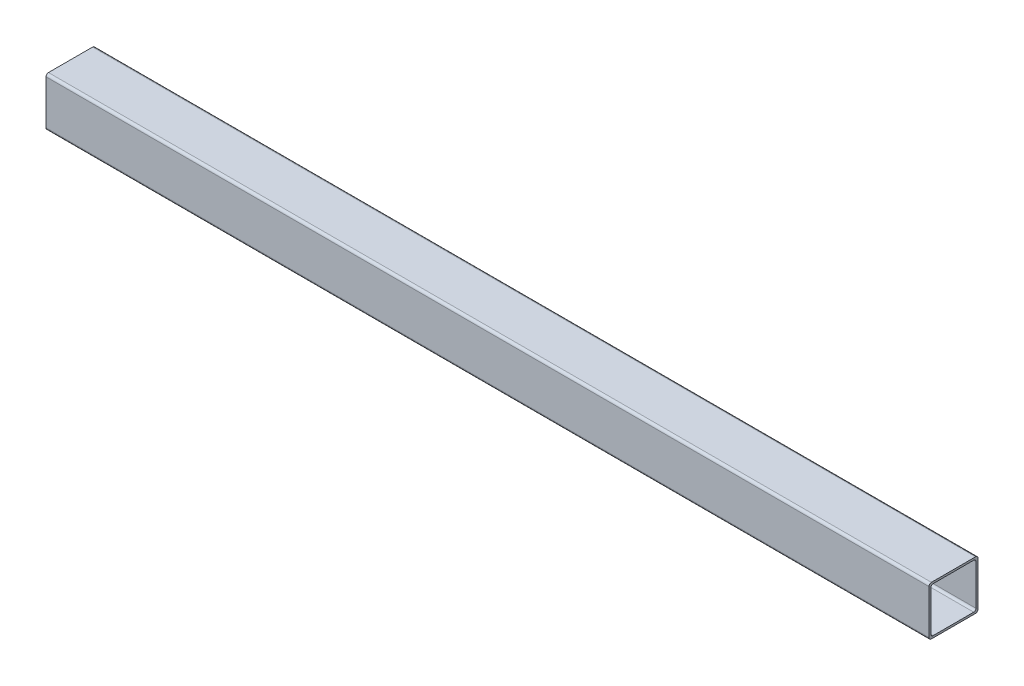
ISO-10303-21;
HEADER;
FILE_DESCRIPTION(('STEP AP214'),'2;1');
FILE_NAME('part.step','',(''),(''),'','','');
FILE_SCHEMA(('AUTOMOTIVE_DESIGN { 1 0 10303 214 1 1 1 1 }'));
ENDSEC;
DATA;
#1=APPLICATION_CONTEXT('core data for automotive mechanical design processes');
#2=APPLICATION_PROTOCOL_DEFINITION('international standard','automotive_design',2000,#1);
#3=PRODUCT_CONTEXT('',#1,'mechanical');
#4=PRODUCT('Part','Part','',(#3));
#5=PRODUCT_RELATED_PRODUCT_CATEGORY('part','',(#4));
#6=PRODUCT_DEFINITION_FORMATION('','',#4);
#7=PRODUCT_DEFINITION_CONTEXT('part definition',#1,'design');
#8=PRODUCT_DEFINITION('design','',#6,#7);
#9=PRODUCT_DEFINITION_SHAPE('','',#8);
#10=(LENGTH_UNIT() NAMED_UNIT(*) SI_UNIT(.MILLI.,.METRE.));
#11=(NAMED_UNIT(*) PLANE_ANGLE_UNIT() SI_UNIT($,.RADIAN.));
#12=(NAMED_UNIT(*) SI_UNIT($,.STERADIAN.) SOLID_ANGLE_UNIT());
#13=UNCERTAINTY_MEASURE_WITH_UNIT(LENGTH_MEASURE(1.E-05),#10,'distance_accuracy_value','');
#14=(GEOMETRIC_REPRESENTATION_CONTEXT(3) GLOBAL_UNCERTAINTY_ASSIGNED_CONTEXT((#13)) GLOBAL_UNIT_ASSIGNED_CONTEXT((#10,
#11,#12)) REPRESENTATION_CONTEXT('',''));
#15=CARTESIAN_POINT('',(0.,0.,0.));
#16=DIRECTION('',(0.,0.,1.));
#17=DIRECTION('',(1.,0.,0.));
#18=AXIS2_PLACEMENT_3D('',#15,#16,#17);
#19=CARTESIAN_POINT('',(457.2,-22.86,-22.86));
#20=DIRECTION('',(1.,0.,0.));
#21=DIRECTION('',(0.,0.,-1.));
#22=AXIS2_PLACEMENT_3D('',#19,#20,#21);
#23=PLANE('',#22);
#24=CARTESIAN_POINT('',(457.2,-22.86,-22.86));
#25=DIRECTION('',(1.,0.,0.));
#26=DIRECTION('',(0.,0.,-1.));
#27=AXIS2_PLACEMENT_3D('',#24,#25,#26);
#28=CIRCLE('',#27,2.53999999999999);
#29=CARTESIAN_POINT('',(457.2,-25.4,-22.86));
#30=VERTEX_POINT('',#29);
#31=CARTESIAN_POINT('',(457.2,-22.86,-25.4));
#32=VERTEX_POINT('',#31);
#33=EDGE_CURVE('E163',#30,#32,#28,.T.);
#34=ORIENTED_EDGE('',*,*,#33,.T.);
#35=DIRECTION('',(0.,1.,0.));
#36=VECTOR('',#35,1.);
#37=CARTESIAN_POINT('',(457.2,-22.86,-25.4));
#38=LINE('',#37,#36);
#39=CARTESIAN_POINT('',(457.2,22.86,-25.4));
#40=VERTEX_POINT('',#39);
#41=EDGE_CURVE('E246',#32,#40,#38,.T.);
#42=ORIENTED_EDGE('',*,*,#41,.T.);
#43=CARTESIAN_POINT('',(457.2,22.86,-22.86));
#44=DIRECTION('',(1.,0.,0.));
#45=DIRECTION('',(0.,0.,-1.));
#46=AXIS2_PLACEMENT_3D('',#43,#44,#45);
#47=CIRCLE('',#46,2.54);
#48=CARTESIAN_POINT('',(457.2,25.4,-22.86));
#49=VERTEX_POINT('',#48);
#50=EDGE_CURVE('E248',#40,#49,#47,.T.);
#51=ORIENTED_EDGE('',*,*,#50,.T.);
#52=DIRECTION('',(0.,0.,1.));
#53=VECTOR('',#52,1.);
#54=CARTESIAN_POINT('',(457.2,25.4,-22.86));
#55=LINE('',#54,#53);
#56=CARTESIAN_POINT('',(457.2,25.4,22.86));
#57=VERTEX_POINT('',#56);
#58=EDGE_CURVE('E250',#49,#57,#55,.T.);
#59=ORIENTED_EDGE('',*,*,#58,.T.);
#60=CARTESIAN_POINT('',(457.2,22.86,22.86));
#61=DIRECTION('',(1.,0.,0.));
#62=DIRECTION('',(0.,0.,-1.));
#63=AXIS2_PLACEMENT_3D('',#60,#61,#62);
#64=CIRCLE('',#63,2.54);
#65=CARTESIAN_POINT('',(457.2,22.86,25.4));
#66=VERTEX_POINT('',#65);
#67=EDGE_CURVE('E252',#57,#66,#64,.T.);
#68=ORIENTED_EDGE('',*,*,#67,.T.);
#69=DIRECTION('',(0.,-1.,0.));
#70=VECTOR('',#69,1.);
#71=CARTESIAN_POINT('',(457.2,-22.86,25.4));
#72=LINE('',#71,#70);
#73=CARTESIAN_POINT('',(457.2,-22.86,25.4));
#74=VERTEX_POINT('',#73);
#75=EDGE_CURVE('E254',#66,#74,#72,.T.);
#76=ORIENTED_EDGE('',*,*,#75,.T.);
#77=CARTESIAN_POINT('',(457.2,-22.86,22.86));
#78=DIRECTION('',(1.,0.,0.));
#79=DIRECTION('',(0.,0.,-1.));
#80=AXIS2_PLACEMENT_3D('',#77,#78,#79);
#81=CIRCLE('',#80,2.54000000000001);
#82=CARTESIAN_POINT('',(457.2,-25.4,22.86));
#83=VERTEX_POINT('',#82);
#84=EDGE_CURVE('E256',#74,#83,#81,.T.);
#85=ORIENTED_EDGE('',*,*,#84,.T.);
#86=DIRECTION('',(0.,0.,-1.));
#87=VECTOR('',#86,1.);
#88=CARTESIAN_POINT('',(457.2,-25.4,-22.86));
#89=LINE('',#88,#87);
#90=EDGE_CURVE('E62',#83,#30,#89,.T.);
#91=ORIENTED_EDGE('',*,*,#90,.T.);
#92=EDGE_LOOP('',(#34,#42,#51,#59,#68,#76,#85,#91));
#93=FACE_BOUND('',#92,.T.);
#94=DIRECTION('',(0.,0.,1.));
#95=VECTOR('',#94,1.);
#96=CARTESIAN_POINT('',(457.2,23.2918,-20.96262));
#97=LINE('',#96,#95);
#98=CARTESIAN_POINT('',(457.2,23.2918,-20.96262));
#99=VERTEX_POINT('',#98);
#100=CARTESIAN_POINT('',(457.2,23.2918,20.96262));
#101=VERTEX_POINT('',#100);
#102=EDGE_CURVE('E219',#99,#101,#97,.T.);
#103=ORIENTED_EDGE('',*,*,#102,.F.);
#104=CARTESIAN_POINT('',(457.2,20.96262,-20.96262));
#105=DIRECTION('',(1.,0.,0.));
#106=DIRECTION('',(0.,0.,-1.));
#107=AXIS2_PLACEMENT_3D('',#104,#105,#106);
#108=CIRCLE('',#107,2.32918);
#109=CARTESIAN_POINT('',(457.2,20.96262,-23.2918));
#110=VERTEX_POINT('',#109);
#111=EDGE_CURVE('E160',#110,#99,#108,.T.);
#112=ORIENTED_EDGE('',*,*,#111,.F.);
#113=DIRECTION('',(0.,1.,0.));
#114=VECTOR('',#113,1.);
#115=CARTESIAN_POINT('',(457.2,20.96262,-23.2918));
#116=LINE('',#115,#114);
#117=CARTESIAN_POINT('',(457.2,-20.96262,-23.2918));
#118=VERTEX_POINT('',#117);
#119=EDGE_CURVE('E231',#118,#110,#116,.T.);
#120=ORIENTED_EDGE('',*,*,#119,.F.);
#121=CARTESIAN_POINT('',(457.2,-20.96262,-20.96262));
#122=DIRECTION('',(1.,0.,0.));
#123=DIRECTION('',(0.,0.,-1.));
#124=AXIS2_PLACEMENT_3D('',#121,#122,#123);
#125=CIRCLE('',#124,2.32918000000001);
#126=CARTESIAN_POINT('',(457.2,-23.2918,-20.96262));
#127=VERTEX_POINT('',#126);
#128=EDGE_CURVE('E229',#127,#118,#125,.T.);
#129=ORIENTED_EDGE('',*,*,#128,.F.);
#130=DIRECTION('',(0.,0.,-1.));
#131=VECTOR('',#130,1.);
#132=CARTESIAN_POINT('',(457.2,-23.2918,-20.96262));
#133=LINE('',#132,#131);
#134=CARTESIAN_POINT('',(457.2,-23.2918,20.96262));
#135=VERTEX_POINT('',#134);
#136=EDGE_CURVE('E227',#135,#127,#133,.T.);
#137=ORIENTED_EDGE('',*,*,#136,.F.);
#138=CARTESIAN_POINT('',(457.2,-20.96262,20.96262));
#139=DIRECTION('',(1.,0.,0.));
#140=DIRECTION('',(0.,0.,-1.));
#141=AXIS2_PLACEMENT_3D('',#138,#139,#140);
#142=CIRCLE('',#141,2.32918);
#143=CARTESIAN_POINT('',(457.2,-20.96262,23.2918));
#144=VERTEX_POINT('',#143);
#145=EDGE_CURVE('E225',#144,#135,#142,.T.);
#146=ORIENTED_EDGE('',*,*,#145,.F.);
#147=DIRECTION('',(0.,-1.,0.));
#148=VECTOR('',#147,1.);
#149=CARTESIAN_POINT('',(457.2,20.96262,23.2918));
#150=LINE('',#149,#148);
#151=CARTESIAN_POINT('',(457.2,20.96262,23.2918));
#152=VERTEX_POINT('',#151);
#153=EDGE_CURVE('E223',#152,#144,#150,.T.);
#154=ORIENTED_EDGE('',*,*,#153,.F.);
#155=CARTESIAN_POINT('',(457.2,20.96262,20.96262));
#156=DIRECTION('',(1.,0.,0.));
#157=DIRECTION('',(0.,0.,-1.));
#158=AXIS2_PLACEMENT_3D('',#155,#156,#157);
#159=CIRCLE('',#158,2.32918000000002);
#160=EDGE_CURVE('E221',#101,#152,#159,.T.);
#161=ORIENTED_EDGE('',*,*,#160,.F.);
#162=EDGE_LOOP('',(#103,#112,#120,#129,#137,#146,#154,#161));
#163=FACE_BOUND('',#162,.T.);
#164=ADVANCED_FACE('F39',(#93,#163),#23,.T.);
#165=CARTESIAN_POINT('',(457.2,-22.86,-22.86));
#166=DIRECTION('',(-1.,0.,0.));
#167=DIRECTION('',(0.,0.,1.));
#168=AXIS2_PLACEMENT_3D('',#165,#166,#167);
#169=CYLINDRICAL_SURFACE('',#168,2.53999999999999);
#170=DIRECTION('',(-1.,0.,0.));
#171=VECTOR('',#170,1.);
#172=CARTESIAN_POINT('',(457.2,-25.4,-22.86));
#173=LINE('',#172,#171);
#174=CARTESIAN_POINT('',(-457.2,-25.4,-22.86));
#175=VERTEX_POINT('',#174);
#176=EDGE_CURVE('E259',#30,#175,#173,.T.);
#177=ORIENTED_EDGE('',*,*,#176,.T.);
#178=CARTESIAN_POINT('',(-457.2,-22.86,-22.86));
#179=DIRECTION('',(1.,0.,0.));
#180=DIRECTION('',(0.,0.,-1.));
#181=AXIS2_PLACEMENT_3D('',#178,#179,#180);
#182=CIRCLE('',#181,2.53999999999999);
#183=CARTESIAN_POINT('',(-457.2,-22.86,-25.4));
#184=VERTEX_POINT('',#183);
#185=EDGE_CURVE('E194',#175,#184,#182,.T.);
#186=ORIENTED_EDGE('',*,*,#185,.T.);
#187=DIRECTION('',(-1.,0.,0.));
#188=VECTOR('',#187,1.);
#189=CARTESIAN_POINT('',(457.2,-22.86,-25.4));
#190=LINE('',#189,#188);
#191=EDGE_CURVE('E11',#32,#184,#190,.T.);
#192=ORIENTED_EDGE('',*,*,#191,.F.);
#193=ORIENTED_EDGE('',*,*,#33,.F.);
#194=EDGE_LOOP('',(#177,#186,#192,#193));
#195=FACE_BOUND('',#194,.T.);
#196=ADVANCED_FACE('F41',(#195),#169,.T.);
#197=CARTESIAN_POINT('',(457.2,-22.86,-25.4));
#198=DIRECTION('',(0.,0.,1.));
#199=DIRECTION('',(1.,0.,0.));
#200=AXIS2_PLACEMENT_3D('',#197,#198,#199);
#201=PLANE('',#200);
#202=ORIENTED_EDGE('',*,*,#191,.T.);
#203=DIRECTION('',(0.,1.,0.));
#204=VECTOR('',#203,1.);
#205=CARTESIAN_POINT('',(-457.2,-22.86,-25.4));
#206=LINE('',#205,#204);
#207=CARTESIAN_POINT('',(-457.2,22.86,-25.4));
#208=VERTEX_POINT('',#207);
#209=EDGE_CURVE('E197',#184,#208,#206,.T.);
#210=ORIENTED_EDGE('',*,*,#209,.T.);
#211=DIRECTION('',(-1.,0.,0.));
#212=VECTOR('',#211,1.);
#213=CARTESIAN_POINT('',(457.2,22.86,-25.4));
#214=LINE('',#213,#212);
#215=EDGE_CURVE('E47',#40,#208,#214,.T.);
#216=ORIENTED_EDGE('',*,*,#215,.F.);
#217=ORIENTED_EDGE('',*,*,#41,.F.);
#218=EDGE_LOOP('',(#202,#210,#216,#217));
#219=FACE_BOUND('',#218,.T.);
#220=ADVANCED_FACE('F281',(#219),#201,.F.);
#221=CARTESIAN_POINT('',(457.2,22.86,-22.86));
#222=DIRECTION('',(-1.,0.,0.));
#223=DIRECTION('',(0.,0.,1.));
#224=AXIS2_PLACEMENT_3D('',#221,#222,#223);
#225=CYLINDRICAL_SURFACE('',#224,2.54);
#226=ORIENTED_EDGE('',*,*,#215,.T.);
#227=CARTESIAN_POINT('',(-457.2,22.86,-22.86));
#228=DIRECTION('',(1.,0.,0.));
#229=DIRECTION('',(0.,0.,-1.));
#230=AXIS2_PLACEMENT_3D('',#227,#228,#229);
#231=CIRCLE('',#230,2.54);
#232=CARTESIAN_POINT('',(-457.2,25.4,-22.86));
#233=VERTEX_POINT('',#232);
#234=EDGE_CURVE('E200',#208,#233,#231,.T.);
#235=ORIENTED_EDGE('',*,*,#234,.T.);
#236=DIRECTION('',(-1.,0.,0.));
#237=VECTOR('',#236,1.);
#238=CARTESIAN_POINT('',(457.2,25.4,-22.86));
#239=LINE('',#238,#237);
#240=EDGE_CURVE('E269',#49,#233,#239,.T.);
#241=ORIENTED_EDGE('',*,*,#240,.F.);
#242=ORIENTED_EDGE('',*,*,#50,.F.);
#243=EDGE_LOOP('',(#226,#235,#241,#242));
#244=FACE_BOUND('',#243,.T.);
#245=ADVANCED_FACE('F274',(#244),#225,.T.);
#246=CARTESIAN_POINT('',(457.2,25.4,-22.86));
#247=DIRECTION('',(0.,-1.,0.));
#248=DIRECTION('',(0.,0.,-1.));
#249=AXIS2_PLACEMENT_3D('',#246,#247,#248);
#250=PLANE('',#249);
#251=ORIENTED_EDGE('',*,*,#240,.T.);
#252=DIRECTION('',(0.,0.,1.));
#253=VECTOR('',#252,1.);
#254=CARTESIAN_POINT('',(-457.2,25.4,-22.86));
#255=LINE('',#254,#253);
#256=CARTESIAN_POINT('',(-457.2,25.4,22.86));
#257=VERTEX_POINT('',#256);
#258=EDGE_CURVE('E203',#233,#257,#255,.T.);
#259=ORIENTED_EDGE('',*,*,#258,.T.);
#260=DIRECTION('',(-1.,0.,0.));
#261=VECTOR('',#260,1.);
#262=CARTESIAN_POINT('',(457.2,25.4,22.86));
#263=LINE('',#262,#261);
#264=EDGE_CURVE('E267',#57,#257,#263,.T.);
#265=ORIENTED_EDGE('',*,*,#264,.F.);
#266=ORIENTED_EDGE('',*,*,#58,.F.);
#267=EDGE_LOOP('',(#251,#259,#265,#266));
#268=FACE_BOUND('',#267,.T.);
#269=ADVANCED_FACE('F304',(#268),#250,.F.);
#270=CARTESIAN_POINT('',(457.2,22.86,22.86));
#271=DIRECTION('',(-1.,0.,0.));
#272=DIRECTION('',(0.,0.,1.));
#273=AXIS2_PLACEMENT_3D('',#270,#271,#272);
#274=CYLINDRICAL_SURFACE('',#273,2.54);
#275=ORIENTED_EDGE('',*,*,#264,.T.);
#276=CARTESIAN_POINT('',(-457.2,22.86,22.86));
#277=DIRECTION('',(1.,0.,0.));
#278=DIRECTION('',(0.,0.,-1.));
#279=AXIS2_PLACEMENT_3D('',#276,#277,#278);
#280=CIRCLE('',#279,2.54);
#281=CARTESIAN_POINT('',(-457.2,22.86,25.4));
#282=VERTEX_POINT('',#281);
#283=EDGE_CURVE('E206',#257,#282,#280,.T.);
#284=ORIENTED_EDGE('',*,*,#283,.T.);
#285=DIRECTION('',(-1.,0.,0.));
#286=VECTOR('',#285,1.);
#287=CARTESIAN_POINT('',(457.2,22.86,25.4));
#288=LINE('',#287,#286);
#289=EDGE_CURVE('E265',#66,#282,#288,.T.);
#290=ORIENTED_EDGE('',*,*,#289,.F.);
#291=ORIENTED_EDGE('',*,*,#67,.F.);
#292=EDGE_LOOP('',(#275,#284,#290,#291));
#293=FACE_BOUND('',#292,.T.);
#294=ADVANCED_FACE('F301',(#293),#274,.T.);
#295=CARTESIAN_POINT('',(457.2,-22.86,25.4));
#296=DIRECTION('',(0.,0.,-1.));
#297=DIRECTION('',(-1.,0.,0.));
#298=AXIS2_PLACEMENT_3D('',#295,#296,#297);
#299=PLANE('',#298);
#300=ORIENTED_EDGE('',*,*,#289,.T.);
#301=DIRECTION('',(0.,-1.,0.));
#302=VECTOR('',#301,1.);
#303=CARTESIAN_POINT('',(-457.2,-22.86,25.4));
#304=LINE('',#303,#302);
#305=CARTESIAN_POINT('',(-457.2,-22.86,25.4));
#306=VERTEX_POINT('',#305);
#307=EDGE_CURVE('E209',#282,#306,#304,.T.);
#308=ORIENTED_EDGE('',*,*,#307,.T.);
#309=DIRECTION('',(-1.,0.,0.));
#310=VECTOR('',#309,1.);
#311=CARTESIAN_POINT('',(457.2,-22.86,25.4));
#312=LINE('',#311,#310);
#313=EDGE_CURVE('E263',#74,#306,#312,.T.);
#314=ORIENTED_EDGE('',*,*,#313,.F.);
#315=ORIENTED_EDGE('',*,*,#75,.F.);
#316=EDGE_LOOP('',(#300,#308,#314,#315));
#317=FACE_BOUND('',#316,.T.);
#318=ADVANCED_FACE('F296',(#317),#299,.F.);
#319=CARTESIAN_POINT('',(457.2,-22.86,22.86));
#320=DIRECTION('',(-1.,0.,0.));
#321=DIRECTION('',(0.,0.,1.));
#322=AXIS2_PLACEMENT_3D('',#319,#320,#321);
#323=CYLINDRICAL_SURFACE('',#322,2.54000000000001);
#324=ORIENTED_EDGE('',*,*,#313,.T.);
#325=CARTESIAN_POINT('',(-457.2,-22.86,22.86));
#326=DIRECTION('',(1.,0.,0.));
#327=DIRECTION('',(0.,0.,-1.));
#328=AXIS2_PLACEMENT_3D('',#325,#326,#327);
#329=CIRCLE('',#328,2.54000000000001);
#330=CARTESIAN_POINT('',(-457.2,-25.4,22.86));
#331=VERTEX_POINT('',#330);
#332=EDGE_CURVE('E212',#306,#331,#329,.T.);
#333=ORIENTED_EDGE('',*,*,#332,.T.);
#334=DIRECTION('',(-1.,0.,0.));
#335=VECTOR('',#334,1.);
#336=CARTESIAN_POINT('',(457.2,-25.4,22.86));
#337=LINE('',#336,#335);
#338=EDGE_CURVE('E261',#83,#331,#337,.T.);
#339=ORIENTED_EDGE('',*,*,#338,.F.);
#340=ORIENTED_EDGE('',*,*,#84,.F.);
#341=EDGE_LOOP('',(#324,#333,#339,#340));
#342=FACE_BOUND('',#341,.T.);
#343=ADVANCED_FACE('F292',(#342),#323,.T.);
#344=CARTESIAN_POINT('',(457.2,-25.4,-22.86));
#345=DIRECTION('',(0.,1.,0.));
#346=DIRECTION('',(0.,0.,1.));
#347=AXIS2_PLACEMENT_3D('',#344,#345,#346);
#348=PLANE('',#347);
#349=ORIENTED_EDGE('',*,*,#338,.T.);
#350=DIRECTION('',(0.,0.,-1.));
#351=VECTOR('',#350,1.);
#352=CARTESIAN_POINT('',(-457.2,-25.4,-22.86));
#353=LINE('',#352,#351);
#354=EDGE_CURVE('E215',#331,#175,#353,.T.);
#355=ORIENTED_EDGE('',*,*,#354,.T.);
#356=ORIENTED_EDGE('',*,*,#176,.F.);
#357=ORIENTED_EDGE('',*,*,#90,.F.);
#358=EDGE_LOOP('',(#349,#355,#356,#357));
#359=FACE_BOUND('',#358,.T.);
#360=ADVANCED_FACE('F288',(#359),#348,.F.);
#361=CARTESIAN_POINT('',(457.2,20.96262,-20.96262));
#362=DIRECTION('',(-1.,0.,0.));
#363=DIRECTION('',(0.,0.,1.));
#364=AXIS2_PLACEMENT_3D('',#361,#362,#363);
#365=CYLINDRICAL_SURFACE('',#364,2.32918);
#366=DIRECTION('',(-1.,0.,0.));
#367=VECTOR('',#366,1.);
#368=CARTESIAN_POINT('',(457.2,23.2918,-20.96262));
#369=LINE('',#368,#367);
#370=CARTESIAN_POINT('',(-457.2,23.2918,-20.96262));
#371=VERTEX_POINT('',#370);
#372=EDGE_CURVE('E152',#99,#371,#369,.T.);
#373=ORIENTED_EDGE('',*,*,#372,.T.);
#374=CARTESIAN_POINT('',(-457.2,20.96262,-20.96262));
#375=DIRECTION('',(1.,0.,0.));
#376=DIRECTION('',(0.,0.,-1.));
#377=AXIS2_PLACEMENT_3D('',#374,#375,#376);
#378=CIRCLE('',#377,2.32918);
#379=CARTESIAN_POINT('',(-457.2,20.96262,-23.2918));
#380=VERTEX_POINT('',#379);
#381=EDGE_CURVE('E157',#380,#371,#378,.T.);
#382=ORIENTED_EDGE('',*,*,#381,.F.);
#383=DIRECTION('',(-1.,0.,0.));
#384=VECTOR('',#383,1.);
#385=CARTESIAN_POINT('',(457.2,20.96262,-23.2918));
#386=LINE('',#385,#384);
#387=EDGE_CURVE('E233',#110,#380,#386,.T.);
#388=ORIENTED_EDGE('',*,*,#387,.F.);
#389=ORIENTED_EDGE('',*,*,#111,.T.);
#390=EDGE_LOOP('',(#373,#382,#388,#389));
#391=FACE_BOUND('',#390,.T.);
#392=ADVANCED_FACE('F154',(#391),#365,.F.);
#393=CARTESIAN_POINT('',(457.2,23.2918,-20.96262));
#394=DIRECTION('',(0.,-1.,0.));
#395=DIRECTION('',(0.,0.,-1.));
#396=AXIS2_PLACEMENT_3D('',#393,#394,#395);
#397=PLANE('',#396);
#398=DIRECTION('',(-1.,0.,0.));
#399=VECTOR('',#398,1.);
#400=CARTESIAN_POINT('',(457.2,23.2918,20.96262));
#401=LINE('',#400,#399);
#402=CARTESIAN_POINT('',(-457.2,23.2918,20.96262));
#403=VERTEX_POINT('',#402);
#404=EDGE_CURVE('E164',#101,#403,#401,.T.);
#405=ORIENTED_EDGE('',*,*,#404,.T.);
#406=DIRECTION('',(0.,0.,1.));
#407=VECTOR('',#406,1.);
#408=CARTESIAN_POINT('',(-457.2,23.2918,-20.96262));
#409=LINE('',#408,#407);
#410=EDGE_CURVE('E167',#371,#403,#409,.T.);
#411=ORIENTED_EDGE('',*,*,#410,.F.);
#412=ORIENTED_EDGE('',*,*,#372,.F.);
#413=ORIENTED_EDGE('',*,*,#102,.T.);
#414=EDGE_LOOP('',(#405,#411,#412,#413));
#415=FACE_BOUND('',#414,.T.);
#416=ADVANCED_FACE('F168',(#415),#397,.T.);
#417=CARTESIAN_POINT('',(457.2,20.96262,20.96262));
#418=DIRECTION('',(-1.,0.,0.));
#419=DIRECTION('',(0.,0.,1.));
#420=AXIS2_PLACEMENT_3D('',#417,#418,#419);
#421=CYLINDRICAL_SURFACE('',#420,2.32918000000002);
#422=DIRECTION('',(-1.,0.,0.));
#423=VECTOR('',#422,1.);
#424=CARTESIAN_POINT('',(457.2,20.96262,23.2918));
#425=LINE('',#424,#423);
#426=CARTESIAN_POINT('',(-457.2,20.96262,23.2918));
#427=VERTEX_POINT('',#426);
#428=EDGE_CURVE('E242',#152,#427,#425,.T.);
#429=ORIENTED_EDGE('',*,*,#428,.T.);
#430=CARTESIAN_POINT('',(-457.2,20.96262,20.96262));
#431=DIRECTION('',(1.,0.,0.));
#432=DIRECTION('',(0.,0.,-1.));
#433=AXIS2_PLACEMENT_3D('',#430,#431,#432);
#434=CIRCLE('',#433,2.32918000000002);
#435=EDGE_CURVE('E173',#403,#427,#434,.T.);
#436=ORIENTED_EDGE('',*,*,#435,.F.);
#437=ORIENTED_EDGE('',*,*,#404,.F.);
#438=ORIENTED_EDGE('',*,*,#160,.T.);
#439=EDGE_LOOP('',(#429,#436,#437,#438));
#440=FACE_BOUND('',#439,.T.);
#441=ADVANCED_FACE('F313',(#440),#421,.F.);
#442=CARTESIAN_POINT('',(457.2,20.96262,23.2918));
#443=DIRECTION('',(0.,0.,-1.));
#444=DIRECTION('',(0.,1.,0.));
#445=AXIS2_PLACEMENT_3D('',#442,#443,#444);
#446=PLANE('',#445);
#447=DIRECTION('',(-1.,0.,0.));
#448=VECTOR('',#447,1.);
#449=CARTESIAN_POINT('',(457.2,-20.96262,23.2918));
#450=LINE('',#449,#448);
#451=CARTESIAN_POINT('',(-457.2,-20.96262,23.2918));
#452=VERTEX_POINT('',#451);
#453=EDGE_CURVE('E240',#144,#452,#450,.T.);
#454=ORIENTED_EDGE('',*,*,#453,.T.);
#455=DIRECTION('',(0.,-1.,0.));
#456=VECTOR('',#455,1.);
#457=CARTESIAN_POINT('',(-457.2,20.96262,23.2918));
#458=LINE('',#457,#456);
#459=EDGE_CURVE('E182',#427,#452,#458,.T.);
#460=ORIENTED_EDGE('',*,*,#459,.F.);
#461=ORIENTED_EDGE('',*,*,#428,.F.);
#462=ORIENTED_EDGE('',*,*,#153,.T.);
#463=EDGE_LOOP('',(#454,#460,#461,#462));
#464=FACE_BOUND('',#463,.T.);
#465=ADVANCED_FACE('F318',(#464),#446,.T.);
#466=CARTESIAN_POINT('',(457.2,-20.96262,20.96262));
#467=DIRECTION('',(-1.,0.,0.));
#468=DIRECTION('',(0.,0.,1.));
#469=AXIS2_PLACEMENT_3D('',#466,#467,#468);
#470=CYLINDRICAL_SURFACE('',#469,2.32918);
#471=DIRECTION('',(-1.,0.,0.));
#472=VECTOR('',#471,1.);
#473=CARTESIAN_POINT('',(457.2,-23.2918,20.96262));
#474=LINE('',#473,#472);
#475=CARTESIAN_POINT('',(-457.2,-23.2918,20.96262));
#476=VERTEX_POINT('',#475);
#477=EDGE_CURVE('E238',#135,#476,#474,.T.);
#478=ORIENTED_EDGE('',*,*,#477,.T.);
#479=CARTESIAN_POINT('',(-457.2,-20.96262,20.96262));
#480=DIRECTION('',(1.,0.,0.));
#481=DIRECTION('',(0.,0.,-1.));
#482=AXIS2_PLACEMENT_3D('',#479,#480,#481);
#483=CIRCLE('',#482,2.32918);
#484=EDGE_CURVE('E185',#452,#476,#483,.T.);
#485=ORIENTED_EDGE('',*,*,#484,.F.);
#486=ORIENTED_EDGE('',*,*,#453,.F.);
#487=ORIENTED_EDGE('',*,*,#145,.T.);
#488=EDGE_LOOP('',(#478,#485,#486,#487));
#489=FACE_BOUND('',#488,.T.);
#490=ADVANCED_FACE('F322',(#489),#470,.F.);
#491=CARTESIAN_POINT('',(457.2,-23.2918,-20.96262));
#492=DIRECTION('',(0.,1.,0.));
#493=DIRECTION('',(0.,0.,1.));
#494=AXIS2_PLACEMENT_3D('',#491,#492,#493);
#495=PLANE('',#494);
#496=DIRECTION('',(-1.,0.,0.));
#497=VECTOR('',#496,1.);
#498=CARTESIAN_POINT('',(457.2,-23.2918,-20.96262));
#499=LINE('',#498,#497);
#500=CARTESIAN_POINT('',(-457.2,-23.2918,-20.96262));
#501=VERTEX_POINT('',#500);
#502=EDGE_CURVE('E236',#127,#501,#499,.T.);
#503=ORIENTED_EDGE('',*,*,#502,.T.);
#504=DIRECTION('',(0.,0.,-1.));
#505=VECTOR('',#504,1.);
#506=CARTESIAN_POINT('',(-457.2,-23.2918,-20.96262));
#507=LINE('',#506,#505);
#508=EDGE_CURVE('E188',#476,#501,#507,.T.);
#509=ORIENTED_EDGE('',*,*,#508,.F.);
#510=ORIENTED_EDGE('',*,*,#477,.F.);
#511=ORIENTED_EDGE('',*,*,#136,.T.);
#512=EDGE_LOOP('',(#503,#509,#510,#511));
#513=FACE_BOUND('',#512,.T.);
#514=ADVANCED_FACE('F327',(#513),#495,.T.);
#515=CARTESIAN_POINT('',(457.2,-20.96262,-20.96262));
#516=DIRECTION('',(-1.,0.,0.));
#517=DIRECTION('',(0.,0.,1.));
#518=AXIS2_PLACEMENT_3D('',#515,#516,#517);
#519=CYLINDRICAL_SURFACE('',#518,2.32918000000001);
#520=DIRECTION('',(-1.,0.,0.));
#521=VECTOR('',#520,1.);
#522=CARTESIAN_POINT('',(457.2,-20.96262,-23.2918));
#523=LINE('',#522,#521);
#524=CARTESIAN_POINT('',(-457.2,-20.96262,-23.2918));
#525=VERTEX_POINT('',#524);
#526=EDGE_CURVE('E54',#118,#525,#523,.T.);
#527=ORIENTED_EDGE('',*,*,#526,.T.);
#528=CARTESIAN_POINT('',(-457.2,-20.96262,-20.96262));
#529=DIRECTION('',(1.,0.,0.));
#530=DIRECTION('',(0.,0.,-1.));
#531=AXIS2_PLACEMENT_3D('',#528,#529,#530);
#532=CIRCLE('',#531,2.32918000000001);
#533=EDGE_CURVE('E191',#501,#525,#532,.T.);
#534=ORIENTED_EDGE('',*,*,#533,.F.);
#535=ORIENTED_EDGE('',*,*,#502,.F.);
#536=ORIENTED_EDGE('',*,*,#128,.T.);
#537=EDGE_LOOP('',(#527,#534,#535,#536));
#538=FACE_BOUND('',#537,.T.);
#539=ADVANCED_FACE('F331',(#538),#519,.F.);
#540=CARTESIAN_POINT('',(457.2,20.96262,-23.2918));
#541=DIRECTION('',(0.,0.,1.));
#542=DIRECTION('',(1.,0.,0.));
#543=AXIS2_PLACEMENT_3D('',#540,#541,#542);
#544=PLANE('',#543);
#545=ORIENTED_EDGE('',*,*,#387,.T.);
#546=DIRECTION('',(0.,1.,0.));
#547=VECTOR('',#546,1.);
#548=CARTESIAN_POINT('',(-457.2,20.96262,-23.2918));
#549=LINE('',#548,#547);
#550=EDGE_CURVE('E178',#525,#380,#549,.T.);
#551=ORIENTED_EDGE('',*,*,#550,.F.);
#552=ORIENTED_EDGE('',*,*,#526,.F.);
#553=ORIENTED_EDGE('',*,*,#119,.T.);
#554=EDGE_LOOP('',(#545,#551,#552,#553));
#555=FACE_BOUND('',#554,.T.);
#556=ADVANCED_FACE('F333',(#555),#544,.T.);
#557=CARTESIAN_POINT('',(-457.2,-22.86,-22.86));
#558=DIRECTION('',(1.,0.,0.));
#559=DIRECTION('',(0.,0.,-1.));
#560=AXIS2_PLACEMENT_3D('',#557,#558,#559);
#561=PLANE('',#560);
#562=ORIENTED_EDGE('',*,*,#550,.T.);
#563=ORIENTED_EDGE('',*,*,#381,.T.);
#564=ORIENTED_EDGE('',*,*,#410,.T.);
#565=ORIENTED_EDGE('',*,*,#435,.T.);
#566=ORIENTED_EDGE('',*,*,#459,.T.);
#567=ORIENTED_EDGE('',*,*,#484,.T.);
#568=ORIENTED_EDGE('',*,*,#508,.T.);
#569=ORIENTED_EDGE('',*,*,#533,.T.);
#570=EDGE_LOOP('',(#562,#563,#564,#565,#566,#567,#568,#569));
#571=FACE_BOUND('',#570,.T.);
#572=ORIENTED_EDGE('',*,*,#185,.F.);
#573=ORIENTED_EDGE('',*,*,#354,.F.);
#574=ORIENTED_EDGE('',*,*,#332,.F.);
#575=ORIENTED_EDGE('',*,*,#307,.F.);
#576=ORIENTED_EDGE('',*,*,#283,.F.);
#577=ORIENTED_EDGE('',*,*,#258,.F.);
#578=ORIENTED_EDGE('',*,*,#234,.F.);
#579=ORIENTED_EDGE('',*,*,#209,.F.);
#580=EDGE_LOOP('',(#572,#573,#574,#575,#576,#577,#578,#579));
#581=FACE_BOUND('',#580,.T.);
#582=ADVANCED_FACE('F175',(#571,#581),#561,.F.);
#583=CLOSED_SHELL('',(#164,#196,#220,#245,#269,#294,#318,#343,#360,#392,#416,#441,#465,#490,
#514,#539,#556,#582));
#584=MANIFOLD_SOLID_BREP('B2',#583);
#585=ADVANCED_BREP_SHAPE_REPRESENTATION('',(#18,#584),#14);
#586=SHAPE_DEFINITION_REPRESENTATION(#9,#585);
ENDSEC;
END-ISO-10303-21;
